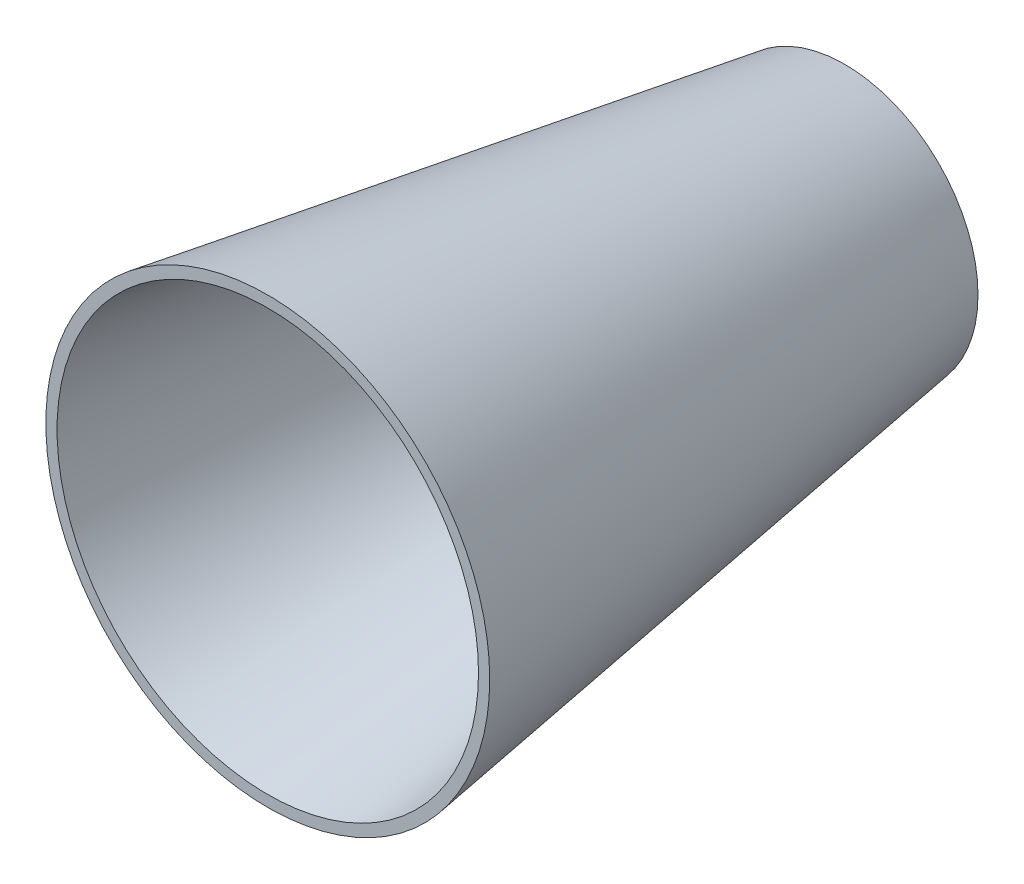
ISO-10303-21;
HEADER;
FILE_DESCRIPTION(('STEP AP214'),'2;1');
FILE_NAME('part.step','',(''),(''),'','','');
FILE_SCHEMA(('AUTOMOTIVE_DESIGN { 1 0 10303 214 1 1 1 1 }'));
ENDSEC;
DATA;
#1=APPLICATION_CONTEXT('core data for automotive mechanical design processes');
#2=APPLICATION_PROTOCOL_DEFINITION('international standard','automotive_design',2000,#1);
#3=PRODUCT_CONTEXT('',#1,'mechanical');
#4=PRODUCT('Part','Part','',(#3));
#5=PRODUCT_RELATED_PRODUCT_CATEGORY('part','',(#4));
#6=PRODUCT_DEFINITION_FORMATION('','',#4);
#7=PRODUCT_DEFINITION_CONTEXT('part definition',#1,'design');
#8=PRODUCT_DEFINITION('design','',#6,#7);
#9=PRODUCT_DEFINITION_SHAPE('','',#8);
#10=(LENGTH_UNIT() NAMED_UNIT(*) SI_UNIT(.MILLI.,.METRE.));
#11=(NAMED_UNIT(*) PLANE_ANGLE_UNIT() SI_UNIT($,.RADIAN.));
#12=(NAMED_UNIT(*) SI_UNIT($,.STERADIAN.) SOLID_ANGLE_UNIT());
#13=UNCERTAINTY_MEASURE_WITH_UNIT(LENGTH_MEASURE(1.E-05),#10,'distance_accuracy_value','');
#14=(GEOMETRIC_REPRESENTATION_CONTEXT(3) GLOBAL_UNCERTAINTY_ASSIGNED_CONTEXT((#13)) GLOBAL_UNIT_ASSIGNED_CONTEXT((#10,
#11,#12)) REPRESENTATION_CONTEXT('',''));
#15=CARTESIAN_POINT('',(0.,0.,0.));
#16=DIRECTION('',(0.,0.,1.));
#17=DIRECTION('',(1.,0.,0.));
#18=AXIS2_PLACEMENT_3D('',#15,#16,#17);
#19=CARTESIAN_POINT('',(0.,0.,130.));
#20=DIRECTION('',(0.,0.,1.));
#21=DIRECTION('',(1.,0.,0.));
#22=AXIS2_PLACEMENT_3D('',#19,#20,#21);
#23=PLANE('',#22);
#24=CARTESIAN_POINT('',(0.,0.,130.));
#25=DIRECTION('',(0.,0.,1.));
#26=DIRECTION('',(1.,0.,0.));
#27=AXIS2_PLACEMENT_3D('',#24,#25,#26);
#28=CIRCLE('',#27,47.4705872234681);
#29=CARTESIAN_POINT('',(47.4705872234681,0.,130.));
#30=VERTEX_POINT('',#29);
#31=EDGE_CURVE('E53',#30,#30,#28,.T.);
#32=ORIENTED_EDGE('',*,*,#31,.F.);
#33=EDGE_LOOP('',(#32));
#34=FACE_BOUND('',#33,.T.);
#35=CARTESIAN_POINT('',(0.,0.,130.));
#36=DIRECTION('',(0.,0.,1.));
#37=DIRECTION('',(1.,0.,0.));
#38=AXIS2_PLACEMENT_3D('',#35,#36,#37);
#39=CIRCLE('',#38,50.);
#40=CARTESIAN_POINT('',(50.,0.,130.));
#41=VERTEX_POINT('',#40);
#42=EDGE_CURVE('E11',#41,#41,#39,.T.);
#43=ORIENTED_EDGE('',*,*,#42,.T.);
#44=EDGE_LOOP('',(#43));
#45=FACE_BOUND('',#44,.T.);
#46=ADVANCED_FACE('F40',(#34,#45),#23,.T.);
#47=CARTESIAN_POINT('',(0.,0.,0.));
#48=DIRECTION('',(0.,0.,1.));
#49=DIRECTION('',(1.,0.,0.));
#50=AXIS2_PLACEMENT_3D('',#47,#48,#49);
#51=PLANE('',#50);
#52=CARTESIAN_POINT('',(0.,0.,0.));
#53=DIRECTION('',(0.,0.,1.));
#54=DIRECTION('',(1.,0.,0.));
#55=AXIS2_PLACEMENT_3D('',#52,#53,#54);
#56=CIRCLE('',#55,30.);
#57=CARTESIAN_POINT('',(30.,0.,0.));
#58=VERTEX_POINT('',#57);
#59=EDGE_CURVE('E48',#58,#58,#56,.T.);
#60=ORIENTED_EDGE('',*,*,#59,.F.);
#61=EDGE_LOOP('',(#60));
#62=FACE_BOUND('',#61,.T.);
#63=ADVANCED_FACE('F72',(#62),#51,.F.);
#64=CARTESIAN_POINT('',(0.,0.,0.));
#65=DIRECTION('',(0.,0.,1.));
#66=DIRECTION('',(1.,0.,0.));
#67=AXIS2_PLACEMENT_3D('',#64,#65,#66);
#68=CONICAL_SURFACE('',#67,30.,0.152649328395265);
#69=ORIENTED_EDGE('',*,*,#59,.T.);
#70=EDGE_LOOP('',(#69));
#71=FACE_BOUND('',#70,.T.);
#72=ORIENTED_EDGE('',*,*,#42,.F.);
#73=EDGE_LOOP('',(#72));
#74=FACE_BOUND('',#73,.T.);
#75=ADVANCED_FACE('F81',(#71,#74),#68,.T.);
#76=CARTESIAN_POINT('',(0.,0.,2.5));
#77=DIRECTION('',(0.,0.,1.));
#78=DIRECTION('',(1.,0.,0.));
#79=AXIS2_PLACEMENT_3D('',#76,#77,#78);
#80=PLANE('',#79);
#81=CARTESIAN_POINT('',(0.,0.,2.5));
#82=DIRECTION('',(0.,0.,1.));
#83=DIRECTION('',(1.,0.,0.));
#84=AXIS2_PLACEMENT_3D('',#81,#82,#83);
#85=CIRCLE('',#84,27.8552026080835);
#86=CARTESIAN_POINT('',(27.8552026080835,0.,2.5));
#87=VERTEX_POINT('',#86);
#88=EDGE_CURVE('E111',#87,#87,#85,.T.);
#89=ORIENTED_EDGE('',*,*,#88,.T.);
#90=EDGE_LOOP('',(#89));
#91=FACE_BOUND('',#90,.T.);
#92=ADVANCED_FACE('F87',(#91),#80,.T.);
#93=CARTESIAN_POINT('',(0.,0.,0.380142960634853));
#94=DIRECTION('',(0.,0.,1.));
#95=DIRECTION('',(1.,0.,0.));
#96=AXIS2_PLACEMENT_3D('',#93,#94,#95);
#97=CONICAL_SURFACE('',#96,27.5290707558735,0.152649328395265);
#98=ORIENTED_EDGE('',*,*,#88,.F.);
#99=EDGE_LOOP('',(#98));
#100=FACE_BOUND('',#99,.T.);
#101=ORIENTED_EDGE('',*,*,#31,.T.);
#102=EDGE_LOOP('',(#101));
#103=FACE_BOUND('',#102,.T.);
#104=ADVANCED_FACE('F83',(#100,#103),#97,.F.);
#105=CLOSED_SHELL('',(#46,#63,#75,#92,#104));
#106=MANIFOLD_SOLID_BREP('B2',#105);
#107=ADVANCED_BREP_SHAPE_REPRESENTATION('',(#18,#106),#14);
#108=SHAPE_DEFINITION_REPRESENTATION(#9,#107);
ENDSEC;
END-ISO-10303-21;
